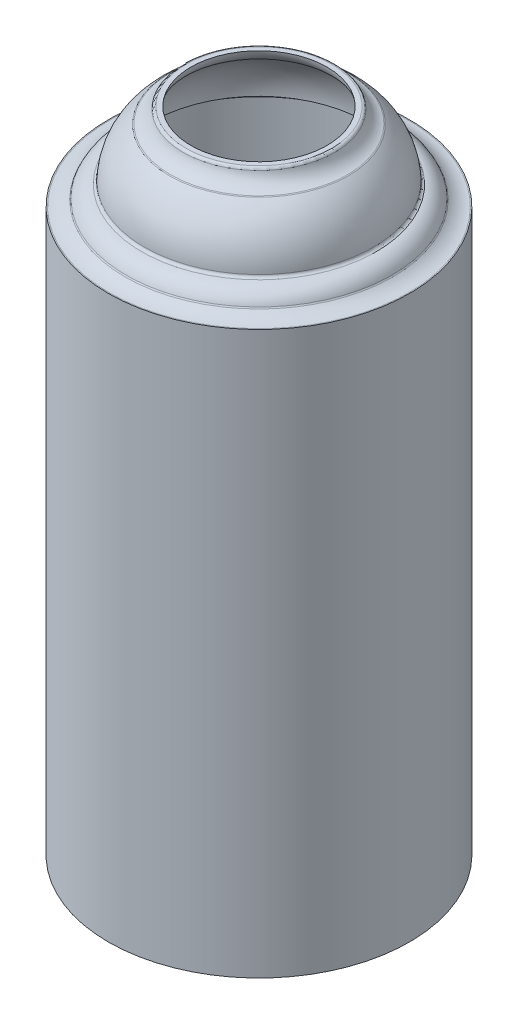
ISO-10303-21;
HEADER;
FILE_DESCRIPTION(('STEP AP214'),'2;1');
FILE_NAME('part.step','',(''),(''),'','','');
FILE_SCHEMA(('AUTOMOTIVE_DESIGN { 1 0 10303 214 1 1 1 1 }'));
ENDSEC;
DATA;
#1=APPLICATION_CONTEXT('core data for automotive mechanical design processes');
#2=APPLICATION_PROTOCOL_DEFINITION('international standard','automotive_design',2000,#1);
#3=PRODUCT_CONTEXT('',#1,'mechanical');
#4=PRODUCT('Part','Part','',(#3));
#5=PRODUCT_RELATED_PRODUCT_CATEGORY('part','',(#4));
#6=PRODUCT_DEFINITION_FORMATION('','',#4);
#7=PRODUCT_DEFINITION_CONTEXT('part definition',#1,'design');
#8=PRODUCT_DEFINITION('design','',#6,#7);
#9=PRODUCT_DEFINITION_SHAPE('','',#8);
#10=(LENGTH_UNIT() NAMED_UNIT(*) SI_UNIT(.MILLI.,.METRE.));
#11=(NAMED_UNIT(*) PLANE_ANGLE_UNIT() SI_UNIT($,.RADIAN.));
#12=(NAMED_UNIT(*) SI_UNIT($,.STERADIAN.) SOLID_ANGLE_UNIT());
#13=UNCERTAINTY_MEASURE_WITH_UNIT(LENGTH_MEASURE(1.E-05),#10,'distance_accuracy_value','');
#14=(GEOMETRIC_REPRESENTATION_CONTEXT(3) GLOBAL_UNCERTAINTY_ASSIGNED_CONTEXT((#13)) GLOBAL_UNIT_ASSIGNED_CONTEXT((#10,
#11,#12)) REPRESENTATION_CONTEXT('',''));
#15=CARTESIAN_POINT('',(0.,0.,0.));
#16=DIRECTION('',(0.,0.,1.));
#17=DIRECTION('',(1.,0.,0.));
#18=AXIS2_PLACEMENT_3D('',#15,#16,#17);
#19=CARTESIAN_POINT('',(0.,246.38,0.));
#20=DIRECTION('',(0.,1.,0.));
#21=DIRECTION('',(0.,0.,1.));
#22=AXIS2_PLACEMENT_3D('',#19,#20,#21);
#23=PLANE('',#22);
#24=CARTESIAN_POINT('',(0.,246.38,0.));
#25=DIRECTION('',(0.,1.,0.));
#26=DIRECTION('',(0.,0.,1.));
#27=AXIS2_PLACEMENT_3D('',#24,#25,#26);
#28=CIRCLE('',#27,65.5959050012918);
#29=CARTESIAN_POINT('',(0.,246.38,65.5959050012918));
#30=VERTEX_POINT('',#29);
#31=EDGE_CURVE('E44',#30,#30,#28,.F.);
#32=ORIENTED_EDGE('',*,*,#31,.T.);
#33=EDGE_LOOP('',(#32));
#34=FACE_BOUND('',#33,.T.);
#35=CARTESIAN_POINT('',(0.,246.38,0.));
#36=DIRECTION('',(0.,1.,0.));
#37=DIRECTION('',(0.,0.,1.));
#38=AXIS2_PLACEMENT_3D('',#35,#36,#37);
#39=CIRCLE('',#38,66.04);
#40=CARTESIAN_POINT('',(0.,246.38,66.04));
#41=VERTEX_POINT('',#40);
#42=EDGE_CURVE('E77',#41,#41,#39,.T.);
#43=ORIENTED_EDGE('',*,*,#42,.T.);
#44=EDGE_LOOP('',(#43));
#45=FACE_BOUND('',#44,.T.);
#46=ADVANCED_FACE('F36',(#34,#45),#23,.T.);
#47=CARTESIAN_POINT('',(0.,0.,0.));
#48=DIRECTION('',(0.,1.,0.));
#49=DIRECTION('',(0.,0.,1.));
#50=AXIS2_PLACEMENT_3D('',#47,#48,#49);
#51=PLANE('',#50);
#52=CARTESIAN_POINT('',(0.,0.,0.));
#53=DIRECTION('',(0.,1.,0.));
#54=DIRECTION('',(0.,0.,1.));
#55=AXIS2_PLACEMENT_3D('',#52,#53,#54);
#56=CIRCLE('',#55,66.04);
#57=CARTESIAN_POINT('',(0.,0.,66.04));
#58=VERTEX_POINT('',#57);
#59=EDGE_CURVE('E78',#58,#58,#56,.T.);
#60=ORIENTED_EDGE('',*,*,#59,.F.);
#61=EDGE_LOOP('',(#60));
#62=FACE_BOUND('',#61,.T.);
#63=CARTESIAN_POINT('',(0.,0.,0.));
#64=DIRECTION('',(0.,1.,0.));
#65=DIRECTION('',(0.,0.,1.));
#66=AXIS2_PLACEMENT_3D('',#63,#64,#65);
#67=CIRCLE('',#66,64.4525);
#68=CARTESIAN_POINT('',(0.,0.,64.4525));
#69=VERTEX_POINT('',#68);
#70=EDGE_CURVE('E81',#69,#69,#67,.T.);
#71=ORIENTED_EDGE('',*,*,#70,.T.);
#72=EDGE_LOOP('',(#71));
#73=FACE_BOUND('',#72,.T.);
#74=ADVANCED_FACE('F122',(#62,#73),#51,.F.);
#75=CARTESIAN_POINT('',(0.,246.38,0.));
#76=DIRECTION('',(0.,-1.,0.));
#77=DIRECTION('',(0.,0.,-1.));
#78=AXIS2_PLACEMENT_3D('',#75,#76,#77);
#79=CYLINDRICAL_SURFACE('',#78,66.04);
#80=ORIENTED_EDGE('',*,*,#59,.T.);
#81=EDGE_LOOP('',(#80));
#82=FACE_BOUND('',#81,.T.);
#83=ORIENTED_EDGE('',*,*,#42,.F.);
#84=EDGE_LOOP('',(#83));
#85=FACE_BOUND('',#84,.T.);
#86=ADVANCED_FACE('F128',(#82,#85),#79,.T.);
#87=CARTESIAN_POINT('',(0.,246.38,0.));
#88=DIRECTION('',(0.,-1.,0.));
#89=DIRECTION('',(0.,0.,-1.));
#90=AXIS2_PLACEMENT_3D('',#87,#88,#89);
#91=CYLINDRICAL_SURFACE('',#90,64.4525);
#92=CARTESIAN_POINT('',(0.,0.950658073217911,0.));
#93=DIRECTION('',(0.,-1.,0.));
#94=DIRECTION('',(0.,0.,-1.));
#95=AXIS2_PLACEMENT_3D('',#92,#93,#94);
#96=CIRCLE('',#95,64.4525);
#97=CARTESIAN_POINT('',(0.,0.950658073217911,-64.4525));
#98=VERTEX_POINT('',#97);
#99=EDGE_CURVE('E10',#98,#98,#96,.T.);
#100=ORIENTED_EDGE('',*,*,#99,.F.);
#101=EDGE_LOOP('',(#100));
#102=FACE_BOUND('',#101,.T.);
#103=ORIENTED_EDGE('',*,*,#70,.F.);
#104=EDGE_LOOP('',(#103));
#105=FACE_BOUND('',#104,.T.);
#106=ADVANCED_FACE('F133',(#102,#105),#91,.F.);
#107=CARTESIAN_POINT('',(0.,254.962138497177,0.));
#108=DIRECTION('',(0.,-1.,0.));
#109=DIRECTION('',(0.,0.,-1.));
#110=AXIS2_PLACEMENT_3D('',#107,#108,#109);
#111=DEGENERATE_TOROIDAL_SURFACE('',#110,21.6163914023813,28.6973388071028,.T.);
#112=CARTESIAN_POINT('',(0.,277.628260774221,0.));
#113=DIRECTION('',(0.,-1.,0.));
#114=DIRECTION('',(0.,0.,-1.));
#115=AXIS2_PLACEMENT_3D('',#112,#113,#114);
#116=CIRCLE('',#115,39.2170776257001);
#117=CARTESIAN_POINT('',(0.,277.628260774221,-39.2170776257001));
#118=VERTEX_POINT('',#117);
#119=EDGE_CURVE('E62',#118,#118,#116,.T.);
#120=ORIENTED_EDGE('',*,*,#119,.T.);
#121=EDGE_LOOP('',(#120));
#122=FACE_BOUND('',#121,.T.);
#123=CARTESIAN_POINT('',(0.,256.102520488577,0.));
#124=DIRECTION('',(0.,-1.,0.));
#125=DIRECTION('',(0.,0.,-1.));
#126=AXIS2_PLACEMENT_3D('',#123,#124,#125);
#127=CIRCLE('',#126,50.2910628655967);
#128=CARTESIAN_POINT('',(0.,256.102520488577,-50.2910628655967));
#129=VERTEX_POINT('',#128);
#130=EDGE_CURVE('E65',#129,#129,#127,.F.);
#131=ORIENTED_EDGE('',*,*,#130,.T.);
#132=EDGE_LOOP('',(#131));
#133=FACE_BOUND('',#132,.T.);
#134=ADVANCED_FACE('F186',(#122,#133),#111,.T.);
#135=CARTESIAN_POINT('',(0.,285.566494107584,0.));
#136=DIRECTION('',(0.,-1.,0.));
#137=DIRECTION('',(0.,0.,-1.));
#138=AXIS2_PLACEMENT_3D('',#135,#136,#137);
#139=TOROIDAL_SURFACE('',#138,40.9685680443677,8.02248112504837);
#140=CARTESIAN_POINT('',(0.,283.532061188649,0.));
#141=DIRECTION('',(0.,1.,0.));
#142=DIRECTION('',(0.,0.,1.));
#143=AXIS2_PLACEMENT_3D('',#140,#141,#142);
#144=CIRCLE('',#143,33.2083305415517);
#145=CARTESIAN_POINT('',(0.,283.532061188649,33.2083305415517));
#146=VERTEX_POINT('',#145);
#147=EDGE_CURVE('E71',#146,#146,#144,.F.);
#148=ORIENTED_EDGE('',*,*,#147,.T.);
#149=EDGE_LOOP('',(#148));
#150=FACE_BOUND('',#149,.T.);
#151=CARTESIAN_POINT('',(0.,277.847179319122,0.));
#152=DIRECTION('',(0.,1.,0.));
#153=DIRECTION('',(0.,0.,1.));
#154=AXIS2_PLACEMENT_3D('',#151,#152,#153);
#155=CIRCLE('',#154,38.783989687248);
#156=CARTESIAN_POINT('',(0.,277.847179319122,38.783989687248));
#157=VERTEX_POINT('',#156);
#158=EDGE_CURVE('E74',#157,#157,#155,.T.);
#159=ORIENTED_EDGE('',*,*,#158,.T.);
#160=EDGE_LOOP('',(#159));
#161=FACE_BOUND('',#160,.T.);
#162=ADVANCED_FACE('F175',(#150,#161),#139,.F.);
#163=CARTESIAN_POINT('',(4.78249918300067E-13,284.48,0.));
#164=DIRECTION('',(0.,-1.,0.));
#165=DIRECTION('',(0.,0.,-1.));
#166=AXIS2_PLACEMENT_3D('',#163,#164,#165);
#167=PLANE('',#166);
#168=CARTESIAN_POINT('',(0.,284.48,0.));
#169=DIRECTION('',(0.,-1.,0.));
#170=DIRECTION('',(0.,0.,-1.));
#171=AXIS2_PLACEMENT_3D('',#168,#169,#170);
#172=CIRCLE('',#171,29.845);
#173=CARTESIAN_POINT('',(0.,284.48,-29.845));
#174=VERTEX_POINT('',#173);
#175=EDGE_CURVE('E95',#174,#174,#172,.T.);
#176=ORIENTED_EDGE('',*,*,#175,.T.);
#177=EDGE_LOOP('',(#176));
#178=FACE_BOUND('',#177,.T.);
#179=CARTESIAN_POINT('',(0.,284.48,0.));
#180=DIRECTION('',(0.,-1.,0.));
#181=DIRECTION('',(0.,0.,-1.));
#182=AXIS2_PLACEMENT_3D('',#179,#180,#181);
#183=CIRCLE('',#182,31.9798450549602);
#184=CARTESIAN_POINT('',(0.,284.48,-31.9798450549602));
#185=VERTEX_POINT('',#184);
#186=EDGE_CURVE('E68',#185,#185,#183,.F.);
#187=ORIENTED_EDGE('',*,*,#186,.T.);
#188=EDGE_LOOP('',(#187));
#189=FACE_BOUND('',#188,.T.);
#190=ADVANCED_FACE('F165',(#178,#189),#167,.F.);
#191=CARTESIAN_POINT('',(0.,257.501093261794,0.));
#192=DIRECTION('',(0.,-1.,0.));
#193=DIRECTION('',(0.,0.,-1.));
#194=AXIS2_PLACEMENT_3D('',#191,#192,#193);
#195=TOROIDAL_SURFACE('',#194,65.8112238839883,11.1234461318774);
#196=CARTESIAN_POINT('',(0.,248.955422133642,0.));
#197=DIRECTION('',(0.,1.,0.));
#198=DIRECTION('',(0.,0.,1.));
#199=AXIS2_PLACEMENT_3D('',#196,#197,#198);
#200=CIRCLE('',#199,58.6906509563203);
#201=CARTESIAN_POINT('',(0.,248.955422133642,58.6906509563203));
#202=VERTEX_POINT('',#201);
#203=EDGE_CURVE('E48',#202,#202,#200,.F.);
#204=ORIENTED_EDGE('',*,*,#203,.T.);
#205=EDGE_LOOP('',(#204));
#206=FACE_BOUND('',#205,.T.);
#207=CARTESIAN_POINT('',(0.,246.380303258923,0.));
#208=DIRECTION('',(0.,1.,0.));
#209=DIRECTION('',(0.,0.,1.));
#210=AXIS2_PLACEMENT_3D('',#207,#208,#209);
#211=CIRCLE('',#210,65.5681527837068);
#212=CARTESIAN_POINT('',(0.,246.380303258923,65.5681527837068));
#213=VERTEX_POINT('',#212);
#214=EDGE_CURVE('E53',#213,#213,#211,.T.);
#215=ORIENTED_EDGE('',*,*,#214,.T.);
#216=EDGE_LOOP('',(#215));
#217=FACE_BOUND('',#216,.T.);
#218=ADVANCED_FACE('F162',(#206,#217),#195,.F.);
#219=CARTESIAN_POINT('',(0.,246.38,0.));
#220=DIRECTION('',(0.,-1.,0.));
#221=DIRECTION('',(0.,0.,-1.));
#222=AXIS2_PLACEMENT_3D('',#219,#220,#221);
#223=TOROIDAL_SURFACE('',#222,50.3137302094841,8.58213849717667);
#224=CARTESIAN_POINT('',(0.,254.893191032186,0.));
#225=DIRECTION('',(0.,-1.,0.));
#226=DIRECTION('',(0.,0.,-1.));
#227=AXIS2_PLACEMENT_3D('',#224,#225,#226);
#228=CIRCLE('',#227,51.399400340903);
#229=CARTESIAN_POINT('',(0.,254.893191032186,-51.399400340903));
#230=VERTEX_POINT('',#229);
#231=EDGE_CURVE('E56',#230,#230,#228,.T.);
#232=ORIENTED_EDGE('',*,*,#231,.T.);
#233=EDGE_LOOP('',(#232));
#234=FACE_BOUND('',#233,.T.);
#235=CARTESIAN_POINT('',(0.,249.47334981781,0.));
#236=DIRECTION('',(0.,-1.,0.));
#237=DIRECTION('',(0.,0.,-1.));
#238=AXIS2_PLACEMENT_3D('',#235,#236,#237);
#239=CIRCLE('',#238,58.3189964817185);
#240=CARTESIAN_POINT('',(0.,249.47334981781,-58.3189964817185));
#241=VERTEX_POINT('',#240);
#242=EDGE_CURVE('E59',#241,#241,#239,.F.);
#243=ORIENTED_EDGE('',*,*,#242,.T.);
#244=EDGE_LOOP('',(#243));
#245=FACE_BOUND('',#244,.T.);
#246=ADVANCED_FACE('F143',(#234,#245),#223,.T.);
#247=CARTESIAN_POINT('',(0.,283.21,0.));
#248=DIRECTION('',(0.,1.,0.));
#249=DIRECTION('',(0.,0.,1.));
#250=AXIS2_PLACEMENT_3D('',#247,#248,#249);
#251=TOROIDAL_SURFACE('',#250,31.9798450549602,1.27);
#252=ORIENTED_EDGE('',*,*,#186,.F.);
#253=EDGE_LOOP('',(#252));
#254=FACE_BOUND('',#253,.T.);
#255=ORIENTED_EDGE('',*,*,#147,.F.);
#256=EDGE_LOOP('',(#255));
#257=FACE_BOUND('',#256,.T.);
#258=ADVANCED_FACE('F139',(#254,#257),#251,.T.);
#259=CARTESIAN_POINT('',(0.,276.625172108567,0.));
#260=DIRECTION('',(0.,1.,0.));
#261=DIRECTION('',(0.,0.,1.));
#262=AXIS2_PLACEMENT_3D('',#259,#260,#261);
#263=TOROIDAL_SURFACE('',#262,38.4381597039425,1.27);
#264=ORIENTED_EDGE('',*,*,#158,.F.);
#265=EDGE_LOOP('',(#264));
#266=FACE_BOUND('',#265,.T.);
#267=ORIENTED_EDGE('',*,*,#119,.F.);
#268=EDGE_LOOP('',(#267));
#269=FACE_BOUND('',#268,.T.);
#270=ADVANCED_FACE('F142',(#266,#269),#263,.T.);
#271=CARTESIAN_POINT('',(0.,256.152988064641,0.));
#272=DIRECTION('',(0.,-1.,0.));
#273=DIRECTION('',(0.,0.,-1.));
#274=AXIS2_PLACEMENT_3D('',#271,#272,#273);
#275=TOROIDAL_SURFACE('',#274,51.5600597228687,1.27);
#276=ORIENTED_EDGE('',*,*,#130,.F.);
#277=EDGE_LOOP('',(#276));
#278=FACE_BOUND('',#277,.T.);
#279=ORIENTED_EDGE('',*,*,#231,.F.);
#280=EDGE_LOOP('',(#279));
#281=FACE_BOUND('',#280,.T.);
#282=ADVANCED_FACE('F147',(#278,#281),#275,.F.);
#283=CARTESIAN_POINT('',(0.,249.931109182788,0.));
#284=DIRECTION('',(0.,-1.,0.));
#285=DIRECTION('',(0.,0.,-1.));
#286=AXIS2_PLACEMENT_3D('',#283,#284,#285);
#287=TOROIDAL_SURFACE('',#286,59.5036299118458,1.27);
#288=ORIENTED_EDGE('',*,*,#242,.F.);
#289=EDGE_LOOP('',(#288));
#290=FACE_BOUND('',#289,.T.);
#291=ORIENTED_EDGE('',*,*,#203,.F.);
#292=EDGE_LOOP('',(#291));
#293=FACE_BOUND('',#292,.T.);
#294=ADVANCED_FACE('F150',(#290,#293),#287,.F.);
#295=CARTESIAN_POINT('',(0.,247.65,0.));
#296=DIRECTION('',(0.,-1.,0.));
#297=DIRECTION('',(0.,0.,-1.));
#298=AXIS2_PLACEMENT_3D('',#295,#296,#297);
#299=TOROIDAL_SURFACE('',#298,65.5959050012918,1.27);
#300=ORIENTED_EDGE('',*,*,#214,.F.);
#301=EDGE_LOOP('',(#300));
#302=FACE_BOUND('',#301,.T.);
#303=ORIENTED_EDGE('',*,*,#31,.F.);
#304=EDGE_LOOP('',(#303));
#305=FACE_BOUND('',#304,.T.);
#306=ADVANCED_FACE('F38',(#302,#305),#299,.F.);
#307=CARTESIAN_POINT('',(0.,-108.479115040638,0.));
#308=DIRECTION('',(0.,1.,0.));
#309=DIRECTION('',(0.,0.,1.));
#310=AXIS2_PLACEMENT_3D('',#307,#308,#309);
#311=SPHERICAL_SURFACE('',#310,127.);
#312=ORIENTED_EDGE('',*,*,#99,.T.);
#313=EDGE_LOOP('',(#312));
#314=FACE_BOUND('',#313,.T.);
#315=ADVANCED_FACE('F110',(#314),#311,.F.);
#316=CARTESIAN_POINT('',(0.,246.38,0.));
#317=DIRECTION('',(0.,-1.,0.));
#318=DIRECTION('',(0.,0.,-1.));
#319=AXIS2_PLACEMENT_3D('',#316,#317,#318);
#320=TOROIDAL_SURFACE('',#319,47.1387302094841,8.58213849717667);
#321=CARTESIAN_POINT('',(0.,249.184097363107,0.));
#322=DIRECTION('',(0.,-1.,0.));
#323=DIRECTION('',(0.,0.,-1.));
#324=AXIS2_PLACEMENT_3D('',#321,#322,#323);
#325=CIRCLE('',#324,55.2498422887825);
#326=CARTESIAN_POINT('',(0.,249.184097363107,-55.2498422887825));
#327=VERTEX_POINT('',#326);
#328=EDGE_CURVE('E89',#327,#327,#325,.T.);
#329=ORIENTED_EDGE('',*,*,#328,.T.);
#330=EDGE_LOOP('',(#329));
#331=FACE_BOUND('',#330,.T.);
#332=CARTESIAN_POINT('',(0.,254.962138497177,0.));
#333=DIRECTION('',(0.,-1.,0.));
#334=DIRECTION('',(0.,0.,-1.));
#335=AXIS2_PLACEMENT_3D('',#332,#333,#334);
#336=CIRCLE('',#335,47.1387302094841);
#337=CARTESIAN_POINT('',(0.,254.962138497177,-47.1387302094841));
#338=VERTEX_POINT('',#337);
#339=EDGE_CURVE('E101',#338,#338,#336,.T.);
#340=ORIENTED_EDGE('',*,*,#339,.F.);
#341=EDGE_LOOP('',(#340));
#342=FACE_BOUND('',#341,.T.);
#343=ADVANCED_FACE('F107',(#331,#342),#320,.F.);
#344=CARTESIAN_POINT('',(0.,257.098518287018,0.));
#345=DIRECTION('',(0.,-1.,0.));
#346=DIRECTION('',(0.,0.,-1.));
#347=AXIS2_PLACEMENT_3D('',#344,#345,#346);
#348=TOROIDAL_SURFACE('',#347,63.0660431106612,11.1234461318774);
#349=CARTESIAN_POINT('',(0.,246.38,0.));
#350=DIRECTION('',(0.,-1.,0.));
#351=DIRECTION('',(0.,0.,-1.));
#352=AXIS2_PLACEMENT_3D('',#349,#350,#351);
#353=CIRCLE('',#352,60.0920862213223);
#354=CARTESIAN_POINT('',(0.,246.38,-60.0920862213223));
#355=VERTEX_POINT('',#354);
#356=EDGE_CURVE('E92',#355,#355,#353,.T.);
#357=ORIENTED_EDGE('',*,*,#356,.T.);
#358=EDGE_LOOP('',(#357));
#359=FACE_BOUND('',#358,.T.);
#360=ORIENTED_EDGE('',*,*,#328,.F.);
#361=EDGE_LOOP('',(#360));
#362=FACE_BOUND('',#361,.T.);
#363=ADVANCED_FACE('F109',(#359,#362),#348,.T.);
#364=CARTESIAN_POINT('',(0.,285.566494107584,0.));
#365=DIRECTION('',(0.,-1.,0.));
#366=DIRECTION('',(0.,0.,-1.));
#367=AXIS2_PLACEMENT_3D('',#364,#365,#366);
#368=TOROIDAL_SURFACE('',#367,37.7935680443677,8.02248112504838);
#369=CARTESIAN_POINT('',(0.,277.786372726395,0.));
#370=DIRECTION('',(0.,-1.,0.));
#371=DIRECTION('',(0.,0.,-1.));
#372=AXIS2_PLACEMENT_3D('',#369,#370,#371);
#373=CIRCLE('',#372,35.8365512596353);
#374=CARTESIAN_POINT('',(0.,277.786372726395,-35.8365512596353));
#375=VERTEX_POINT('',#374);
#376=EDGE_CURVE('E98',#375,#375,#373,.T.);
#377=ORIENTED_EDGE('',*,*,#376,.T.);
#378=EDGE_LOOP('',(#377));
#379=FACE_BOUND('',#378,.T.);
#380=ORIENTED_EDGE('',*,*,#175,.F.);
#381=EDGE_LOOP('',(#380));
#382=FACE_BOUND('',#381,.T.);
#383=ADVANCED_FACE('F117',(#379,#382),#368,.T.);
#384=CARTESIAN_POINT('',(0.,254.962138497177,0.));
#385=DIRECTION('',(0.,-1.,0.));
#386=DIRECTION('',(0.,0.,-1.));
#387=AXIS2_PLACEMENT_3D('',#384,#385,#386);
#388=DEGENERATE_TOROIDAL_SURFACE('',#387,18.4413914023813,28.6973388071028,.T.);
#389=ORIENTED_EDGE('',*,*,#376,.F.);
#390=EDGE_LOOP('',(#389));
#391=FACE_BOUND('',#390,.T.);
#392=ORIENTED_EDGE('',*,*,#339,.T.);
#393=EDGE_LOOP('',(#392));
#394=FACE_BOUND('',#393,.T.);
#395=ADVANCED_FACE('F105',(#391,#394),#388,.F.);
#396=CARTESIAN_POINT('',(0.,246.38,0.));
#397=DIRECTION('',(0.,1.,0.));
#398=DIRECTION('',(0.,0.,1.));
#399=AXIS2_PLACEMENT_3D('',#396,#397,#398);
#400=PLANE('',#399);
#401=ORIENTED_EDGE('',*,*,#356,.F.);
#402=EDGE_LOOP('',(#401));
#403=FACE_BOUND('',#402,.T.);
#404=CARTESIAN_POINT('',(0.,246.38,0.));
#405=DIRECTION('',(0.,1.,0.));
#406=DIRECTION('',(0.,0.,1.));
#407=AXIS2_PLACEMENT_3D('',#404,#405,#406);
#408=CIRCLE('',#407,64.4525);
#409=CARTESIAN_POINT('',(0.,246.38,64.4525));
#410=VERTEX_POINT('',#409);
#411=EDGE_CURVE('E86',#410,#410,#408,.T.);
#412=ORIENTED_EDGE('',*,*,#411,.F.);
#413=EDGE_LOOP('',(#412));
#414=FACE_BOUND('',#413,.T.);
#415=ADVANCED_FACE('F179',(#403,#414),#400,.F.);
#416=ORIENTED_EDGE('',*,*,#411,.T.);
#417=EDGE_LOOP('',(#416));
#418=FACE_BOUND('',#417,.T.);
#419=CARTESIAN_POINT('',(0.,4.12565807321789,0.));
#420=DIRECTION('',(0.,-1.,0.));
#421=DIRECTION('',(0.,0.,-1.));
#422=AXIS2_PLACEMENT_3D('',#419,#420,#421);
#423=CIRCLE('',#422,64.4525);
#424=CARTESIAN_POINT('',(0.,4.12565807321789,-64.4525));
#425=VERTEX_POINT('',#424);
#426=EDGE_CURVE('E40',#425,#425,#423,.T.);
#427=ORIENTED_EDGE('',*,*,#426,.T.);
#428=EDGE_LOOP('',(#427));
#429=FACE_BOUND('',#428,.T.);
#430=ADVANCED_FACE('F181',(#418,#429),#91,.F.);
#431=CARTESIAN_POINT('',(0.,-105.304115040638,0.));
#432=DIRECTION('',(0.,1.,0.));
#433=DIRECTION('',(0.,0.,1.));
#434=AXIS2_PLACEMENT_3D('',#431,#432,#433);
#435=SPHERICAL_SURFACE('',#434,127.);
#436=ORIENTED_EDGE('',*,*,#426,.F.);
#437=EDGE_LOOP('',(#436));
#438=FACE_BOUND('',#437,.T.);
#439=ADVANCED_FACE('F191',(#438),#435,.T.);
#440=CLOSED_SHELL('',(#46,#74,#86,#106,#134,#162,#190,#218,#246,#258,#270,#282,#294,#306,#315,
#343,#363,#383,#395,#415,#430,#439));
#441=MANIFOLD_SOLID_BREP('B2',#440);
#442=ADVANCED_BREP_SHAPE_REPRESENTATION('',(#18,#441),#14);
#443=SHAPE_DEFINITION_REPRESENTATION(#9,#442);
ENDSEC;
END-ISO-10303-21;
